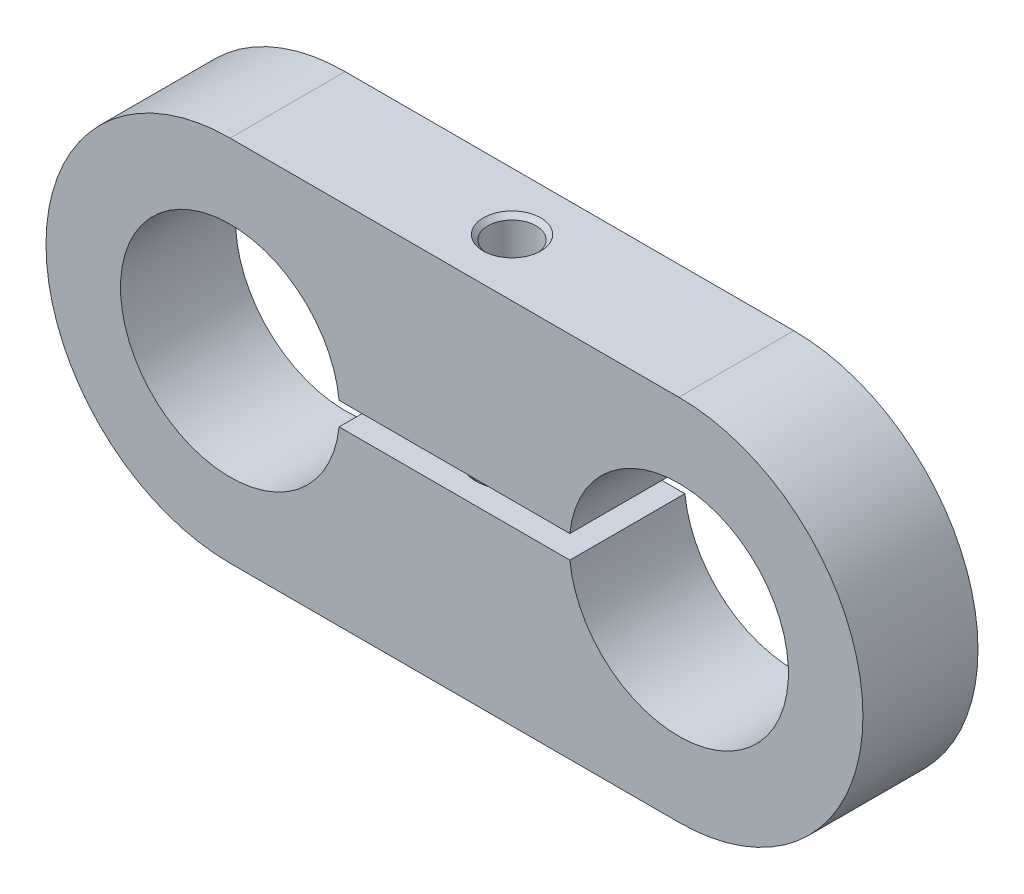
ISO-10303-21;
HEADER;
FILE_DESCRIPTION(('STEP AP214'),'2;1');
FILE_NAME('part.step','',(''),(''),'','','');
FILE_SCHEMA(('AUTOMOTIVE_DESIGN { 1 0 10303 214 1 1 1 1 }'));
ENDSEC;
DATA;
#1=APPLICATION_CONTEXT('core data for automotive mechanical design processes');
#2=APPLICATION_PROTOCOL_DEFINITION('international standard','automotive_design',2000,#1);
#3=PRODUCT_CONTEXT('',#1,'mechanical');
#4=PRODUCT('Part','Part','',(#3));
#5=PRODUCT_RELATED_PRODUCT_CATEGORY('part','',(#4));
#6=PRODUCT_DEFINITION_FORMATION('','',#4);
#7=PRODUCT_DEFINITION_CONTEXT('part definition',#1,'design');
#8=PRODUCT_DEFINITION('design','',#6,#7);
#9=PRODUCT_DEFINITION_SHAPE('','',#8);
#10=(LENGTH_UNIT() NAMED_UNIT(*) SI_UNIT(.MILLI.,.METRE.));
#11=(NAMED_UNIT(*) PLANE_ANGLE_UNIT() SI_UNIT($,.RADIAN.));
#12=(NAMED_UNIT(*) SI_UNIT($,.STERADIAN.) SOLID_ANGLE_UNIT());
#13=UNCERTAINTY_MEASURE_WITH_UNIT(LENGTH_MEASURE(1.E-05),#10,'distance_accuracy_value','');
#14=(GEOMETRIC_REPRESENTATION_CONTEXT(3) GLOBAL_UNCERTAINTY_ASSIGNED_CONTEXT((#13)) GLOBAL_UNIT_ASSIGNED_CONTEXT((#10,
#11,#12)) REPRESENTATION_CONTEXT('',''));
#15=CARTESIAN_POINT('',(0.,0.,0.));
#16=DIRECTION('',(0.,0.,1.));
#17=DIRECTION('',(1.,0.,0.));
#18=AXIS2_PLACEMENT_3D('',#15,#16,#17);
#19=CARTESIAN_POINT('',(19.5,16.,5.));
#20=DIRECTION('',(0.,-1.,0.));
#21=DIRECTION('',(1.,0.,0.));
#22=AXIS2_PLACEMENT_3D('',#19,#20,#21);
#23=CYLINDRICAL_SURFACE('',#22,2.1);
#24=CARTESIAN_POINT('',(19.5,15.5999999996652,5.));
#25=DIRECTION('',(0.,1.,0.));
#26=DIRECTION('',(0.,0.,1.));
#27=AXIS2_PLACEMENT_3D('',#24,#25,#26);
#28=CIRCLE('',#27,2.1000000003778);
#29=CARTESIAN_POINT('',(19.5,15.5999999996652,7.1000000003778));
#30=VERTEX_POINT('',#29);
#31=EDGE_CURVE('E120',#30,#30,#28,.T.);
#32=ORIENTED_EDGE('',*,*,#31,.T.);
#33=EDGE_LOOP('',(#32));
#34=FACE_BOUND('',#33,.T.);
#35=CARTESIAN_POINT('',(19.5,1.39999999998963,5.));
#36=DIRECTION('',(0.,-1.,0.));
#37=DIRECTION('',(0.,0.,-1.));
#38=AXIS2_PLACEMENT_3D('',#35,#36,#37);
#39=CIRCLE('',#38,2.099999999989);
#40=CARTESIAN_POINT('',(19.5,1.39999999998963,2.900000000011));
#41=VERTEX_POINT('',#40);
#42=EDGE_CURVE('E183',#41,#41,#39,.T.);
#43=ORIENTED_EDGE('',*,*,#42,.T.);
#44=EDGE_LOOP('',(#43));
#45=FACE_BOUND('',#44,.T.);
#46=ADVANCED_FACE('F37',(#34,#45),#23,.F.);
#47=CARTESIAN_POINT('',(19.5,-16.,5.));
#48=DIRECTION('',(0.,1.,0.));
#49=DIRECTION('',(0.,0.,1.));
#50=AXIS2_PLACEMENT_3D('',#47,#48,#49);
#51=CYLINDRICAL_SURFACE('',#50,2.75);
#52=CARTESIAN_POINT('',(19.5,-15.5999999996652,5.));
#53=DIRECTION('',(0.,-1.,0.));
#54=DIRECTION('',(0.,0.,-1.));
#55=AXIS2_PLACEMENT_3D('',#52,#53,#54);
#56=CIRCLE('',#55,2.75000000033742);
#57=CARTESIAN_POINT('',(19.5,-15.5999999996652,2.24999999966258));
#58=VERTEX_POINT('',#57);
#59=EDGE_CURVE('E188',#58,#58,#56,.T.);
#60=ORIENTED_EDGE('',*,*,#59,.T.);
#61=EDGE_LOOP('',(#60));
#62=FACE_BOUND('',#61,.T.);
#63=CARTESIAN_POINT('',(19.5,-1.39999999993279,5.));
#64=DIRECTION('',(0.,1.,0.));
#65=DIRECTION('',(0.,0.,1.));
#66=AXIS2_PLACEMENT_3D('',#63,#64,#65);
#67=CIRCLE('',#66,2.74999999998727);
#68=CARTESIAN_POINT('',(19.5,-1.39999999993279,7.74999999998727));
#69=VERTEX_POINT('',#68);
#70=EDGE_CURVE('E177',#69,#69,#67,.T.);
#71=ORIENTED_EDGE('',*,*,#70,.T.);
#72=EDGE_LOOP('',(#71));
#73=FACE_BOUND('',#72,.T.);
#74=ADVANCED_FACE('F217',(#62,#73),#51,.F.);
#75=CARTESIAN_POINT('',(19.5,16.0000000000196,5.));
#76=DIRECTION('',(0.,1.,0.));
#77=DIRECTION('',(0.,0.,1.));
#78=AXIS2_PLACEMENT_3D('',#75,#76,#77);
#79=CONICAL_SURFACE('',#78,2.49999999999318,0.785398162473743);
#80=CARTESIAN_POINT('',(19.5,16.0000000000196,5.));
#81=DIRECTION('',(0.,1.,0.));
#82=DIRECTION('',(0.,0.,1.));
#83=AXIS2_PLACEMENT_3D('',#80,#81,#82);
#84=CIRCLE('',#83,2.49999999999318);
#85=CARTESIAN_POINT('',(19.5,16.0000000000196,7.49999999999318));
#86=VERTEX_POINT('',#85);
#87=EDGE_CURVE('E171',#86,#86,#84,.F.);
#88=ORIENTED_EDGE('',*,*,#87,.F.);
#89=EDGE_LOOP('',(#88));
#90=FACE_BOUND('',#89,.T.);
#91=ORIENTED_EDGE('',*,*,#31,.F.);
#92=EDGE_LOOP('',(#91));
#93=FACE_BOUND('',#92,.T.);
#94=ADVANCED_FACE('F214',(#90,#93),#79,.F.);
#95=CARTESIAN_POINT('',(19.5,-15.9999999999059,5.));
#96=DIRECTION('',(0.,-1.,0.));
#97=DIRECTION('',(0.,0.,-1.));
#98=AXIS2_PLACEMENT_3D('',#95,#96,#97);
#99=CONICAL_SURFACE('',#98,3.14999999983911,0.785398162473743);
#100=CARTESIAN_POINT('',(19.5,-16.0000000000196,5.));
#101=DIRECTION('',(0.,-1.,0.));
#102=DIRECTION('',(0.,0.,-1.));
#103=AXIS2_PLACEMENT_3D('',#100,#101,#102);
#104=CIRCLE('',#103,3.1499999999528);
#105=CARTESIAN_POINT('',(19.5,-16.0000000000196,1.8500000000472));
#106=VERTEX_POINT('',#105);
#107=EDGE_CURVE('E164',#106,#106,#104,.F.);
#108=ORIENTED_EDGE('',*,*,#107,.F.);
#109=EDGE_LOOP('',(#108));
#110=FACE_BOUND('',#109,.T.);
#111=ORIENTED_EDGE('',*,*,#59,.F.);
#112=EDGE_LOOP('',(#111));
#113=FACE_BOUND('',#112,.T.);
#114=ADVANCED_FACE('F216',(#110,#113),#99,.F.);
#115=CARTESIAN_POINT('',(19.5,0.999999999635293,5.));
#116=DIRECTION('',(0.,-1.,0.));
#117=DIRECTION('',(0.,0.,-1.));
#118=AXIS2_PLACEMENT_3D('',#115,#116,#117);
#119=CONICAL_SURFACE('',#118,2.49999999960437,0.785398162473743);
#120=ORIENTED_EDGE('',*,*,#42,.F.);
#121=EDGE_LOOP('',(#120));
#122=FACE_BOUND('',#121,.T.);
#123=CARTESIAN_POINT('',(19.5,0.999999999635293,5.));
#124=DIRECTION('',(0.,-1.,0.));
#125=DIRECTION('',(0.,0.,-1.));
#126=AXIS2_PLACEMENT_3D('',#123,#124,#125);
#127=CIRCLE('',#126,2.49999999960437);
#128=CARTESIAN_POINT('',(19.5,0.999999999635293,2.50000000039563));
#129=VERTEX_POINT('',#128);
#130=EDGE_CURVE('E160',#129,#129,#127,.F.);
#131=ORIENTED_EDGE('',*,*,#130,.F.);
#132=EDGE_LOOP('',(#131));
#133=FACE_BOUND('',#132,.T.);
#134=ADVANCED_FACE('F224',(#122,#133),#119,.F.);
#135=CARTESIAN_POINT('',(19.5,-0.999999999578449,5.));
#136=DIRECTION('',(0.,1.,0.));
#137=DIRECTION('',(0.,0.,1.));
#138=AXIS2_PLACEMENT_3D('',#135,#136,#137);
#139=CONICAL_SURFACE('',#138,3.14999999960264,0.785398162473743);
#140=ORIENTED_EDGE('',*,*,#70,.F.);
#141=EDGE_LOOP('',(#140));
#142=FACE_BOUND('',#141,.T.);
#143=CARTESIAN_POINT('',(19.5,-0.999999999578449,5.));
#144=DIRECTION('',(0.,1.,0.));
#145=DIRECTION('',(0.,0.,1.));
#146=AXIS2_PLACEMENT_3D('',#143,#144,#145);
#147=CIRCLE('',#146,3.14999999960264);
#148=CARTESIAN_POINT('',(19.5,-0.999999999578449,8.14999999960264));
#149=VERTEX_POINT('',#148);
#150=EDGE_CURVE('E157',#149,#149,#147,.F.);
#151=ORIENTED_EDGE('',*,*,#150,.F.);
#152=EDGE_LOOP('',(#151));
#153=FACE_BOUND('',#152,.T.);
#154=ADVANCED_FACE('F259',(#142,#153),#139,.F.);
#155=CARTESIAN_POINT('',(0.,0.,0.));
#156=DIRECTION('',(0.,0.,-1.));
#157=DIRECTION('',(-1.,0.,0.));
#158=AXIS2_PLACEMENT_3D('',#155,#156,#157);
#159=PLANE('',#158);
#160=DIRECTION('',(1.,0.,0.));
#161=VECTOR('',#160,1.);
#162=CARTESIAN_POINT('',(19.5,1.,0.));
#163=LINE('',#162,#161);
#164=CARTESIAN_POINT('',(9.47236111009288,1.,0.));
#165=VERTEX_POINT('',#164);
#166=CARTESIAN_POINT('',(29.5276388899071,1.,0.));
#167=VERTEX_POINT('',#166);
#168=EDGE_CURVE('E86',#165,#167,#163,.T.);
#169=ORIENTED_EDGE('',*,*,#168,.F.);
#170=CARTESIAN_POINT('',(0.,0.,0.));
#171=DIRECTION('',(0.,0.,-1.));
#172=DIRECTION('',(1.,0.,0.));
#173=AXIS2_PLACEMENT_3D('',#170,#171,#172);
#174=CIRCLE('',#173,9.525);
#175=CARTESIAN_POINT('',(9.47236111009288,-0.999999999999992,0.));
#176=VERTEX_POINT('',#175);
#177=EDGE_CURVE('E119',#176,#165,#174,.T.);
#178=ORIENTED_EDGE('',*,*,#177,.F.);
#179=DIRECTION('',(1.,0.,0.));
#180=VECTOR('',#179,1.);
#181=CARTESIAN_POINT('',(10.9544511501033,-1.,0.));
#182=LINE('',#181,#180);
#183=CARTESIAN_POINT('',(29.5276388899071,-0.999999999999992,0.));
#184=VERTEX_POINT('',#183);
#185=EDGE_CURVE('E156',#184,#176,#182,.F.);
#186=ORIENTED_EDGE('',*,*,#185,.F.);
#187=CARTESIAN_POINT('',(39.,0.,0.));
#188=DIRECTION('',(0.,0.,-1.));
#189=DIRECTION('',(-1.,0.,0.));
#190=AXIS2_PLACEMENT_3D('',#187,#188,#189);
#191=CIRCLE('',#190,9.525);
#192=EDGE_CURVE('E395',#167,#184,#191,.T.);
#193=ORIENTED_EDGE('',*,*,#192,.F.);
#194=EDGE_LOOP('',(#169,#178,#186,#193));
#195=FACE_BOUND('',#194,.T.);
#196=CARTESIAN_POINT('',(0.,0.,0.));
#197=DIRECTION('',(0.,0.,-1.));
#198=DIRECTION('',(-1.,0.,0.));
#199=AXIS2_PLACEMENT_3D('',#196,#197,#198);
#200=CIRCLE('',#199,16.);
#201=CARTESIAN_POINT('',(0.,16.,0.));
#202=VERTEX_POINT('',#201);
#203=CARTESIAN_POINT('',(0.,-16.,0.));
#204=VERTEX_POINT('',#203);
#205=EDGE_CURVE('E40',#202,#204,#200,.F.);
#206=ORIENTED_EDGE('',*,*,#205,.F.);
#207=DIRECTION('',(-1.,0.,0.));
#208=VECTOR('',#207,1.);
#209=CARTESIAN_POINT('',(0.,16.,0.));
#210=LINE('',#209,#208);
#211=CARTESIAN_POINT('',(39.,16.,0.));
#212=VERTEX_POINT('',#211);
#213=EDGE_CURVE('E77',#212,#202,#210,.T.);
#214=ORIENTED_EDGE('',*,*,#213,.F.);
#215=CARTESIAN_POINT('',(39.,0.,0.));
#216=DIRECTION('',(0.,0.,-1.));
#217=DIRECTION('',(-1.,0.,0.));
#218=AXIS2_PLACEMENT_3D('',#215,#216,#217);
#219=CIRCLE('',#218,16.);
#220=CARTESIAN_POINT('',(39.,-16.,0.));
#221=VERTEX_POINT('',#220);
#222=EDGE_CURVE('E169',#221,#212,#219,.F.);
#223=ORIENTED_EDGE('',*,*,#222,.F.);
#224=DIRECTION('',(1.,0.,0.));
#225=VECTOR('',#224,1.);
#226=CARTESIAN_POINT('',(19.5,-16.,0.));
#227=LINE('',#226,#225);
#228=EDGE_CURVE('E167',#204,#221,#227,.T.);
#229=ORIENTED_EDGE('',*,*,#228,.F.);
#230=EDGE_LOOP('',(#206,#214,#223,#229));
#231=FACE_BOUND('',#230,.T.);
#232=ADVANCED_FACE('F256',(#195,#231),#159,.T.);
#233=CARTESIAN_POINT('',(0.,0.,10.));
#234=DIRECTION('',(0.,0.,-1.));
#235=DIRECTION('',(-1.,0.,0.));
#236=AXIS2_PLACEMENT_3D('',#233,#234,#235);
#237=CYLINDRICAL_SURFACE('',#236,16.);
#238=CARTESIAN_POINT('',(0.,0.,10.));
#239=DIRECTION('',(0.,0.,-1.));
#240=DIRECTION('',(-1.,0.,0.));
#241=AXIS2_PLACEMENT_3D('',#238,#239,#240);
#242=CIRCLE('',#241,16.);
#243=CARTESIAN_POINT('',(0.,-16.,10.));
#244=VERTEX_POINT('',#243);
#245=CARTESIAN_POINT('',(0.,16.,10.));
#246=VERTEX_POINT('',#245);
#247=EDGE_CURVE('E152',#244,#246,#242,.T.);
#248=ORIENTED_EDGE('',*,*,#247,.T.);
#249=DIRECTION('',(0.,0.,1.));
#250=VECTOR('',#249,1.);
#251=CARTESIAN_POINT('',(0.,16.,10.));
#252=LINE('',#251,#250);
#253=EDGE_CURVE('E170',#202,#246,#252,.T.);
#254=ORIENTED_EDGE('',*,*,#253,.F.);
#255=ORIENTED_EDGE('',*,*,#205,.T.);
#256=DIRECTION('',(0.,0.,-1.));
#257=VECTOR('',#256,1.);
#258=CARTESIAN_POINT('',(0.,-16.,10.));
#259=LINE('',#258,#257);
#260=EDGE_CURVE('E163',#244,#204,#259,.T.);
#261=ORIENTED_EDGE('',*,*,#260,.F.);
#262=EDGE_LOOP('',(#248,#254,#255,#261));
#263=FACE_BOUND('',#262,.T.);
#264=ADVANCED_FACE('F253',(#263),#237,.T.);
#265=CARTESIAN_POINT('',(0.,16.,10.));
#266=DIRECTION('',(0.,1.,0.));
#267=DIRECTION('',(-1.,0.,0.));
#268=AXIS2_PLACEMENT_3D('',#265,#266,#267);
#269=PLANE('',#268);
#270=DIRECTION('',(-1.,0.,0.));
#271=VECTOR('',#270,1.);
#272=CARTESIAN_POINT('',(0.,16.,10.));
#273=LINE('',#272,#271);
#274=CARTESIAN_POINT('',(39.,16.,10.));
#275=VERTEX_POINT('',#274);
#276=EDGE_CURVE('E149',#246,#275,#273,.F.);
#277=ORIENTED_EDGE('',*,*,#276,.T.);
#278=DIRECTION('',(0.,0.,-1.));
#279=VECTOR('',#278,1.);
#280=CARTESIAN_POINT('',(39.,16.,10.));
#281=LINE('',#280,#279);
#282=EDGE_CURVE('E168',#212,#275,#281,.F.);
#283=ORIENTED_EDGE('',*,*,#282,.F.);
#284=ORIENTED_EDGE('',*,*,#213,.T.);
#285=ORIENTED_EDGE('',*,*,#253,.T.);
#286=EDGE_LOOP('',(#277,#283,#284,#285));
#287=FACE_BOUND('',#286,.T.);
#288=ORIENTED_EDGE('',*,*,#87,.T.);
#289=EDGE_LOOP('',(#288));
#290=FACE_BOUND('',#289,.T.);
#291=ADVANCED_FACE('F249',(#287,#290),#269,.T.);
#292=CARTESIAN_POINT('',(39.,0.,10.));
#293=DIRECTION('',(0.,0.,-1.));
#294=DIRECTION('',(-1.,0.,0.));
#295=AXIS2_PLACEMENT_3D('',#292,#293,#294);
#296=CYLINDRICAL_SURFACE('',#295,16.);
#297=CARTESIAN_POINT('',(39.,0.,10.));
#298=DIRECTION('',(0.,0.,-1.));
#299=DIRECTION('',(-1.,0.,0.));
#300=AXIS2_PLACEMENT_3D('',#297,#298,#299);
#301=CIRCLE('',#300,16.);
#302=CARTESIAN_POINT('',(39.,-16.,10.));
#303=VERTEX_POINT('',#302);
#304=EDGE_CURVE('E145',#275,#303,#301,.T.);
#305=ORIENTED_EDGE('',*,*,#304,.T.);
#306=DIRECTION('',(0.,0.,-1.));
#307=VECTOR('',#306,1.);
#308=CARTESIAN_POINT('',(39.,-16.,10.));
#309=LINE('',#308,#307);
#310=EDGE_CURVE('E55',#221,#303,#309,.F.);
#311=ORIENTED_EDGE('',*,*,#310,.F.);
#312=ORIENTED_EDGE('',*,*,#222,.T.);
#313=ORIENTED_EDGE('',*,*,#282,.T.);
#314=EDGE_LOOP('',(#305,#311,#312,#313));
#315=FACE_BOUND('',#314,.T.);
#316=ADVANCED_FACE('F246',(#315),#296,.T.);
#317=CARTESIAN_POINT('',(19.5,-16.,10.));
#318=DIRECTION('',(0.,-1.,0.));
#319=DIRECTION('',(0.,0.,-1.));
#320=AXIS2_PLACEMENT_3D('',#317,#318,#319);
#321=PLANE('',#320);
#322=DIRECTION('',(-1.,0.,0.));
#323=VECTOR('',#322,1.);
#324=CARTESIAN_POINT('',(0.,-16.,10.));
#325=LINE('',#324,#323);
#326=EDGE_CURVE('E112',#303,#244,#325,.T.);
#327=ORIENTED_EDGE('',*,*,#326,.T.);
#328=ORIENTED_EDGE('',*,*,#260,.T.);
#329=ORIENTED_EDGE('',*,*,#228,.T.);
#330=ORIENTED_EDGE('',*,*,#310,.T.);
#331=EDGE_LOOP('',(#327,#328,#329,#330));
#332=FACE_BOUND('',#331,.T.);
#333=ORIENTED_EDGE('',*,*,#107,.T.);
#334=EDGE_LOOP('',(#333));
#335=FACE_BOUND('',#334,.T.);
#336=ADVANCED_FACE('F243',(#332,#335),#321,.T.);
#337=CARTESIAN_POINT('',(19.5,1.,10.));
#338=DIRECTION('',(0.,-1.,0.));
#339=DIRECTION('',(0.,0.,-1.));
#340=AXIS2_PLACEMENT_3D('',#337,#338,#339);
#341=PLANE('',#340);
#342=DIRECTION('',(-1.,0.,0.));
#343=VECTOR('',#342,1.);
#344=CARTESIAN_POINT('',(0.,1.,10.));
#345=LINE('',#344,#343);
#346=CARTESIAN_POINT('',(29.5276388899071,1.,10.));
#347=VERTEX_POINT('',#346);
#348=CARTESIAN_POINT('',(9.47236111009288,1.,10.));
#349=VERTEX_POINT('',#348);
#350=EDGE_CURVE('E46',#347,#349,#345,.T.);
#351=ORIENTED_EDGE('',*,*,#350,.T.);
#352=DIRECTION('',(0.,0.,1.));
#353=VECTOR('',#352,1.);
#354=CARTESIAN_POINT('',(9.47236111009288,1.,0.));
#355=LINE('',#354,#353);
#356=EDGE_CURVE('E103',#165,#349,#355,.T.);
#357=ORIENTED_EDGE('',*,*,#356,.F.);
#358=ORIENTED_EDGE('',*,*,#168,.T.);
#359=DIRECTION('',(0.,0.,1.));
#360=VECTOR('',#359,1.);
#361=CARTESIAN_POINT('',(29.5276388899071,1.,0.));
#362=LINE('',#361,#360);
#363=EDGE_CURVE('E107',#167,#347,#362,.T.);
#364=ORIENTED_EDGE('',*,*,#363,.T.);
#365=EDGE_LOOP('',(#351,#357,#358,#364));
#366=FACE_BOUND('',#365,.T.);
#367=ORIENTED_EDGE('',*,*,#130,.T.);
#368=EDGE_LOOP('',(#367));
#369=FACE_BOUND('',#368,.T.);
#370=ADVANCED_FACE('F101',(#366,#369),#341,.T.);
#371=CARTESIAN_POINT('',(10.9544511501033,-1.,10.));
#372=DIRECTION('',(0.,1.,0.));
#373=DIRECTION('',(0.,0.,1.));
#374=AXIS2_PLACEMENT_3D('',#371,#372,#373);
#375=PLANE('',#374);
#376=DIRECTION('',(-1.,0.,0.));
#377=VECTOR('',#376,1.);
#378=CARTESIAN_POINT('',(0.,-0.999999999999987,10.));
#379=LINE('',#378,#377);
#380=CARTESIAN_POINT('',(9.47236111009288,-0.999999999999992,10.));
#381=VERTEX_POINT('',#380);
#382=CARTESIAN_POINT('',(29.5276388899071,-0.999999999999992,10.));
#383=VERTEX_POINT('',#382);
#384=EDGE_CURVE('E12',#381,#383,#379,.F.);
#385=ORIENTED_EDGE('',*,*,#384,.T.);
#386=DIRECTION('',(0.,0.,1.));
#387=VECTOR('',#386,1.);
#388=CARTESIAN_POINT('',(29.5276388899071,-0.999999999999992,0.));
#389=LINE('',#388,#387);
#390=EDGE_CURVE('E126',#184,#383,#389,.T.);
#391=ORIENTED_EDGE('',*,*,#390,.F.);
#392=ORIENTED_EDGE('',*,*,#185,.T.);
#393=DIRECTION('',(0.,0.,1.));
#394=VECTOR('',#393,1.);
#395=CARTESIAN_POINT('',(9.47236111009288,-0.999999999999992,0.));
#396=LINE('',#395,#394);
#397=EDGE_CURVE('E121',#176,#381,#396,.T.);
#398=ORIENTED_EDGE('',*,*,#397,.T.);
#399=EDGE_LOOP('',(#385,#391,#392,#398));
#400=FACE_BOUND('',#399,.T.);
#401=ORIENTED_EDGE('',*,*,#150,.T.);
#402=EDGE_LOOP('',(#401));
#403=FACE_BOUND('',#402,.T.);
#404=ADVANCED_FACE('F229',(#400,#403),#375,.T.);
#405=CARTESIAN_POINT('',(0.,0.,10.));
#406=DIRECTION('',(0.,0.,-1.));
#407=DIRECTION('',(-1.,0.,0.));
#408=AXIS2_PLACEMENT_3D('',#405,#406,#407);
#409=PLANE('',#408);
#410=ORIENTED_EDGE('',*,*,#384,.F.);
#411=CARTESIAN_POINT('',(0.,0.,10.));
#412=DIRECTION('',(0.,0.,-1.));
#413=DIRECTION('',(1.,0.,0.));
#414=AXIS2_PLACEMENT_3D('',#411,#412,#413);
#415=CIRCLE('',#414,9.525);
#416=EDGE_CURVE('E118',#381,#349,#415,.T.);
#417=ORIENTED_EDGE('',*,*,#416,.T.);
#418=ORIENTED_EDGE('',*,*,#350,.F.);
#419=CARTESIAN_POINT('',(39.,0.,10.));
#420=DIRECTION('',(0.,0.,-1.));
#421=DIRECTION('',(-1.,0.,0.));
#422=AXIS2_PLACEMENT_3D('',#419,#420,#421);
#423=CIRCLE('',#422,9.525);
#424=EDGE_CURVE('E389',#347,#383,#423,.T.);
#425=ORIENTED_EDGE('',*,*,#424,.T.);
#426=EDGE_LOOP('',(#410,#417,#418,#425));
#427=FACE_BOUND('',#426,.T.);
#428=ORIENTED_EDGE('',*,*,#304,.F.);
#429=ORIENTED_EDGE('',*,*,#276,.F.);
#430=ORIENTED_EDGE('',*,*,#247,.F.);
#431=ORIENTED_EDGE('',*,*,#326,.F.);
#432=EDGE_LOOP('',(#428,#429,#430,#431));
#433=FACE_BOUND('',#432,.T.);
#434=ADVANCED_FACE('F123',(#427,#433),#409,.F.);
#435=CARTESIAN_POINT('',(0.,0.,0.));
#436=DIRECTION('',(0.,0.,1.));
#437=DIRECTION('',(1.,0.,0.));
#438=AXIS2_PLACEMENT_3D('',#435,#436,#437);
#439=CYLINDRICAL_SURFACE('',#438,9.525);
#440=ORIENTED_EDGE('',*,*,#416,.F.);
#441=ORIENTED_EDGE('',*,*,#397,.F.);
#442=ORIENTED_EDGE('',*,*,#177,.T.);
#443=ORIENTED_EDGE('',*,*,#356,.T.);
#444=EDGE_LOOP('',(#440,#441,#442,#443));
#445=FACE_BOUND('',#444,.T.);
#446=ADVANCED_FACE('F116',(#445),#439,.F.);
#447=CARTESIAN_POINT('',(39.,0.,0.));
#448=DIRECTION('',(0.,0.,1.));
#449=DIRECTION('',(1.,0.,0.));
#450=AXIS2_PLACEMENT_3D('',#447,#448,#449);
#451=CYLINDRICAL_SURFACE('',#450,9.525);
#452=ORIENTED_EDGE('',*,*,#424,.F.);
#453=ORIENTED_EDGE('',*,*,#363,.F.);
#454=ORIENTED_EDGE('',*,*,#192,.T.);
#455=ORIENTED_EDGE('',*,*,#390,.T.);
#456=EDGE_LOOP('',(#452,#453,#454,#455));
#457=FACE_BOUND('',#456,.T.);
#458=ADVANCED_FACE('F235',(#457),#451,.F.);
#459=CLOSED_SHELL('',(#46,#74,#94,#114,#134,#154,#232,#264,#291,#316,#336,#370,#404,#434,#446,#458));
#460=MANIFOLD_SOLID_BREP('B2',#459);
#461=ADVANCED_BREP_SHAPE_REPRESENTATION('',(#18,#460),#14);
#462=SHAPE_DEFINITION_REPRESENTATION(#9,#461);
ENDSEC;
END-ISO-10303-21;
